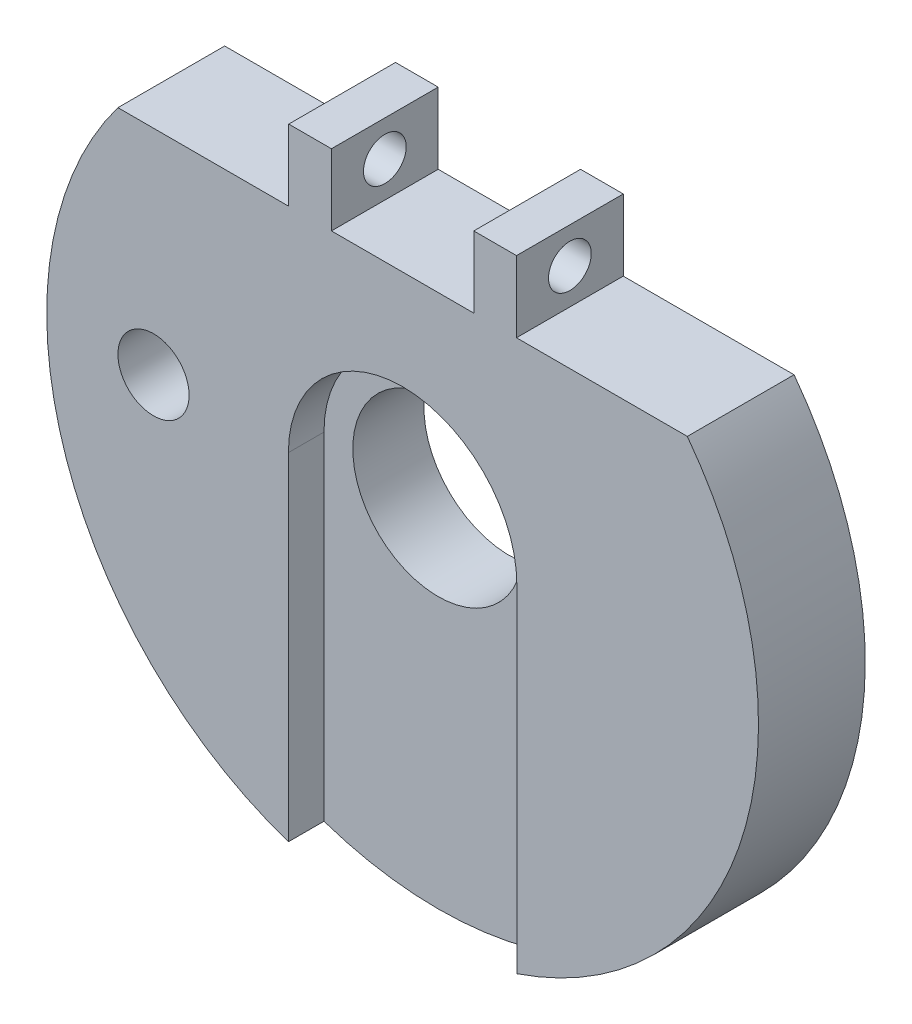
ISO-10303-21;
HEADER;
FILE_DESCRIPTION(('STEP AP214'),'2;1');
FILE_NAME('part.step','',(''),(''),'','','');
FILE_SCHEMA(('AUTOMOTIVE_DESIGN { 1 0 10303 214 1 1 1 1 }'));
ENDSEC;
DATA;
#1=APPLICATION_CONTEXT('core data for automotive mechanical design processes');
#2=APPLICATION_PROTOCOL_DEFINITION('international standard','automotive_design',2000,#1);
#3=PRODUCT_CONTEXT('',#1,'mechanical');
#4=PRODUCT('Part','Part','',(#3));
#5=PRODUCT_RELATED_PRODUCT_CATEGORY('part','',(#4));
#6=PRODUCT_DEFINITION_FORMATION('','',#4);
#7=PRODUCT_DEFINITION_CONTEXT('part definition',#1,'design');
#8=PRODUCT_DEFINITION('design','',#6,#7);
#9=PRODUCT_DEFINITION_SHAPE('','',#8);
#10=(LENGTH_UNIT() NAMED_UNIT(*) SI_UNIT(.MILLI.,.METRE.));
#11=(NAMED_UNIT(*) PLANE_ANGLE_UNIT() SI_UNIT($,.RADIAN.));
#12=(NAMED_UNIT(*) SI_UNIT($,.STERADIAN.) SOLID_ANGLE_UNIT());
#13=UNCERTAINTY_MEASURE_WITH_UNIT(LENGTH_MEASURE(1.E-05),#10,'distance_accuracy_value','');
#14=(GEOMETRIC_REPRESENTATION_CONTEXT(3) GLOBAL_UNCERTAINTY_ASSIGNED_CONTEXT((#13)) GLOBAL_UNIT_ASSIGNED_CONTEXT((#10,
#11,#12)) REPRESENTATION_CONTEXT('',''));
#15=CARTESIAN_POINT('',(0.,0.,0.));
#16=DIRECTION('',(0.,0.,1.));
#17=DIRECTION('',(1.,0.,0.));
#18=AXIS2_PLACEMENT_3D('',#15,#16,#17);
#19=CARTESIAN_POINT('',(-10.,40.,15.));
#20=DIRECTION('',(-1.,0.,0.));
#21=DIRECTION('',(0.,-1.,0.));
#22=AXIS2_PLACEMENT_3D('',#19,#20,#21);
#23=PLANE('',#22);
#24=CARTESIAN_POINT('',(-10.,35.,7.5));
#25=DIRECTION('',(-1.,0.,0.));
#26=DIRECTION('',(0.,-1.,0.));
#27=AXIS2_PLACEMENT_3D('',#24,#25,#26);
#28=CIRCLE('',#27,2.99999999999999);
#29=CARTESIAN_POINT('',(-10.,32.,7.5));
#30=VERTEX_POINT('',#29);
#31=EDGE_CURVE('E229',#30,#30,#28,.T.);
#32=ORIENTED_EDGE('',*,*,#31,.T.);
#33=EDGE_LOOP('',(#32));
#34=FACE_BOUND('',#33,.T.);
#35=DIRECTION('',(0.,1.,0.));
#36=VECTOR('',#35,1.);
#37=CARTESIAN_POINT('',(-10.,40.,0.));
#38=LINE('',#37,#36);
#39=CARTESIAN_POINT('',(-10.,30.,0.));
#40=VERTEX_POINT('',#39);
#41=CARTESIAN_POINT('',(-10.,40.,0.));
#42=VERTEX_POINT('',#41);
#43=EDGE_CURVE('E159',#40,#42,#38,.T.);
#44=ORIENTED_EDGE('',*,*,#43,.T.);
#45=DIRECTION('',(0.,0.,-1.));
#46=VECTOR('',#45,1.);
#47=CARTESIAN_POINT('',(-10.,40.,15.));
#48=LINE('',#47,#46);
#49=CARTESIAN_POINT('',(-10.,40.,15.));
#50=VERTEX_POINT('',#49);
#51=EDGE_CURVE('E198',#50,#42,#48,.T.);
#52=ORIENTED_EDGE('',*,*,#51,.F.);
#53=DIRECTION('',(0.,1.,0.));
#54=VECTOR('',#53,1.);
#55=CARTESIAN_POINT('',(-10.,40.,15.));
#56=LINE('',#55,#54);
#57=CARTESIAN_POINT('',(-10.,30.,15.));
#58=VERTEX_POINT('',#57);
#59=EDGE_CURVE('E179',#58,#50,#56,.T.);
#60=ORIENTED_EDGE('',*,*,#59,.F.);
#61=DIRECTION('',(0.,0.,-1.));
#62=VECTOR('',#61,1.);
#63=CARTESIAN_POINT('',(-10.,30.,15.));
#64=LINE('',#63,#62);
#65=EDGE_CURVE('E155',#58,#40,#64,.T.);
#66=ORIENTED_EDGE('',*,*,#65,.T.);
#67=EDGE_LOOP('',(#44,#52,#60,#66));
#68=FACE_BOUND('',#67,.T.);
#69=ADVANCED_FACE('F37',(#34,#68),#23,.F.);
#70=CARTESIAN_POINT('',(-16.,40.,15.));
#71=DIRECTION('',(0.,-1.,0.));
#72=DIRECTION('',(1.,0.,0.));
#73=AXIS2_PLACEMENT_3D('',#70,#71,#72);
#74=PLANE('',#73);
#75=DIRECTION('',(-1.,0.,0.));
#76=VECTOR('',#75,1.);
#77=CARTESIAN_POINT('',(-16.,40.,0.));
#78=LINE('',#77,#76);
#79=CARTESIAN_POINT('',(-16.,40.,0.));
#80=VERTEX_POINT('',#79);
#81=EDGE_CURVE('E162',#42,#80,#78,.T.);
#82=ORIENTED_EDGE('',*,*,#81,.T.);
#83=DIRECTION('',(0.,0.,-1.));
#84=VECTOR('',#83,1.);
#85=CARTESIAN_POINT('',(-16.,40.,15.));
#86=LINE('',#85,#84);
#87=CARTESIAN_POINT('',(-16.,40.,15.));
#88=VERTEX_POINT('',#87);
#89=EDGE_CURVE('E195',#88,#80,#86,.T.);
#90=ORIENTED_EDGE('',*,*,#89,.F.);
#91=DIRECTION('',(-1.,0.,0.));
#92=VECTOR('',#91,1.);
#93=CARTESIAN_POINT('',(-16.,40.,15.));
#94=LINE('',#93,#92);
#95=EDGE_CURVE('E109',#50,#88,#94,.T.);
#96=ORIENTED_EDGE('',*,*,#95,.F.);
#97=ORIENTED_EDGE('',*,*,#51,.T.);
#98=EDGE_LOOP('',(#82,#90,#96,#97));
#99=FACE_BOUND('',#98,.T.);
#100=ADVANCED_FACE('F267',(#99),#74,.F.);
#101=CARTESIAN_POINT('',(-16.,30.,15.));
#102=DIRECTION('',(1.,0.,0.));
#103=DIRECTION('',(0.,0.,-1.));
#104=AXIS2_PLACEMENT_3D('',#101,#102,#103);
#105=PLANE('',#104);
#106=CARTESIAN_POINT('',(-16.,35.,7.5));
#107=DIRECTION('',(-1.,0.,0.));
#108=DIRECTION('',(0.,0.,1.));
#109=AXIS2_PLACEMENT_3D('',#106,#107,#108);
#110=CIRCLE('',#109,3.);
#111=CARTESIAN_POINT('',(-16.,35.,10.5));
#112=VERTEX_POINT('',#111);
#113=EDGE_CURVE('E298',#112,#112,#110,.T.);
#114=ORIENTED_EDGE('',*,*,#113,.F.);
#115=EDGE_LOOP('',(#114));
#116=FACE_BOUND('',#115,.T.);
#117=DIRECTION('',(0.,-1.,0.));
#118=VECTOR('',#117,1.);
#119=CARTESIAN_POINT('',(-16.,30.,0.));
#120=LINE('',#119,#118);
#121=CARTESIAN_POINT('',(-16.,30.,0.));
#122=VERTEX_POINT('',#121);
#123=EDGE_CURVE('E165',#80,#122,#120,.T.);
#124=ORIENTED_EDGE('',*,*,#123,.T.);
#125=DIRECTION('',(0.,0.,-1.));
#126=VECTOR('',#125,1.);
#127=CARTESIAN_POINT('',(-16.,30.,15.));
#128=LINE('',#127,#126);
#129=CARTESIAN_POINT('',(-16.,30.,15.));
#130=VERTEX_POINT('',#129);
#131=EDGE_CURVE('E192',#130,#122,#128,.T.);
#132=ORIENTED_EDGE('',*,*,#131,.F.);
#133=DIRECTION('',(0.,-1.,0.));
#134=VECTOR('',#133,1.);
#135=CARTESIAN_POINT('',(-16.,30.,15.));
#136=LINE('',#135,#134);
#137=EDGE_CURVE('E241',#88,#130,#136,.T.);
#138=ORIENTED_EDGE('',*,*,#137,.F.);
#139=ORIENTED_EDGE('',*,*,#89,.T.);
#140=EDGE_LOOP('',(#124,#132,#138,#139));
#141=FACE_BOUND('',#140,.T.);
#142=ADVANCED_FACE('F270',(#116,#141),#105,.F.);
#143=CARTESIAN_POINT('',(-40.,30.,15.));
#144=DIRECTION('',(0.,-1.,0.));
#145=DIRECTION('',(0.,0.,-1.));
#146=AXIS2_PLACEMENT_3D('',#143,#144,#145);
#147=PLANE('',#146);
#148=DIRECTION('',(-1.,0.,0.));
#149=VECTOR('',#148,1.);
#150=CARTESIAN_POINT('',(-40.,30.,0.));
#151=LINE('',#150,#149);
#152=CARTESIAN_POINT('',(-40.,30.,0.));
#153=VERTEX_POINT('',#152);
#154=EDGE_CURVE('E167',#122,#153,#151,.T.);
#155=ORIENTED_EDGE('',*,*,#154,.T.);
#156=DIRECTION('',(0.,0.,-1.));
#157=VECTOR('',#156,1.);
#158=CARTESIAN_POINT('',(-40.,30.,15.));
#159=LINE('',#158,#157);
#160=CARTESIAN_POINT('',(-40.,30.,15.));
#161=VERTEX_POINT('',#160);
#162=EDGE_CURVE('E189',#161,#153,#159,.T.);
#163=ORIENTED_EDGE('',*,*,#162,.F.);
#164=DIRECTION('',(-1.,0.,0.));
#165=VECTOR('',#164,1.);
#166=CARTESIAN_POINT('',(-40.,30.,15.));
#167=LINE('',#166,#165);
#168=EDGE_CURVE('E243',#130,#161,#167,.T.);
#169=ORIENTED_EDGE('',*,*,#168,.F.);
#170=ORIENTED_EDGE('',*,*,#131,.T.);
#171=EDGE_LOOP('',(#155,#163,#169,#170));
#172=FACE_BOUND('',#171,.T.);
#173=ADVANCED_FACE('F275',(#172),#147,.F.);
#174=CARTESIAN_POINT('',(0.,0.,15.));
#175=DIRECTION('',(0.,0.,-1.));
#176=DIRECTION('',(-1.,0.,0.));
#177=AXIS2_PLACEMENT_3D('',#174,#175,#176);
#178=CYLINDRICAL_SURFACE('',#177,50.);
#179=CARTESIAN_POINT('',(0.,0.,15.));
#180=DIRECTION('',(0.,0.,1.));
#181=DIRECTION('',(1.,0.,0.));
#182=AXIS2_PLACEMENT_3D('',#179,#180,#181);
#183=CIRCLE('',#182,50.);
#184=CARTESIAN_POINT('',(16.05,-47.3539597077161,15.));
#185=VERTEX_POINT('',#184);
#186=CARTESIAN_POINT('',(40.,30.,15.));
#187=VERTEX_POINT('',#186);
#188=EDGE_CURVE('E245',#185,#187,#183,.T.);
#189=ORIENTED_EDGE('',*,*,#188,.F.);
#190=DIRECTION('',(0.,0.,-1.));
#191=VECTOR('',#190,1.);
#192=CARTESIAN_POINT('',(16.05,-47.3539597077161,15.));
#193=LINE('',#192,#191);
#194=CARTESIAN_POINT('',(16.05,-47.3539597077161,10.));
#195=VERTEX_POINT('',#194);
#196=EDGE_CURVE('E163',#185,#195,#193,.T.);
#197=ORIENTED_EDGE('',*,*,#196,.T.);
#198=CARTESIAN_POINT('',(0.,0.,10.));
#199=DIRECTION('',(0.,0.,1.));
#200=DIRECTION('',(1.,0.,0.));
#201=AXIS2_PLACEMENT_3D('',#198,#199,#200);
#202=CIRCLE('',#201,50.);
#203=CARTESIAN_POINT('',(-16.05,-47.3539597077161,10.));
#204=VERTEX_POINT('',#203);
#205=EDGE_CURVE('E11',#204,#195,#202,.T.);
#206=ORIENTED_EDGE('',*,*,#205,.F.);
#207=DIRECTION('',(0.,0.,-1.));
#208=VECTOR('',#207,1.);
#209=CARTESIAN_POINT('',(-16.05,-47.3539597077161,15.));
#210=LINE('',#209,#208);
#211=CARTESIAN_POINT('',(-16.05,-47.3539597077161,15.));
#212=VERTEX_POINT('',#211);
#213=EDGE_CURVE('E218',#204,#212,#210,.F.);
#214=ORIENTED_EDGE('',*,*,#213,.T.);
#215=EDGE_CURVE('E246',#161,#212,#183,.T.);
#216=ORIENTED_EDGE('',*,*,#215,.F.);
#217=ORIENTED_EDGE('',*,*,#162,.T.);
#218=CARTESIAN_POINT('',(0.,0.,0.));
#219=DIRECTION('',(0.,0.,1.));
#220=DIRECTION('',(1.,0.,0.));
#221=AXIS2_PLACEMENT_3D('',#218,#219,#220);
#222=CIRCLE('',#221,50.);
#223=CARTESIAN_POINT('',(40.,30.,0.));
#224=VERTEX_POINT('',#223);
#225=EDGE_CURVE('E169',#153,#224,#222,.T.);
#226=ORIENTED_EDGE('',*,*,#225,.T.);
#227=DIRECTION('',(0.,0.,-1.));
#228=VECTOR('',#227,1.);
#229=CARTESIAN_POINT('',(40.,30.,15.));
#230=LINE('',#229,#228);
#231=EDGE_CURVE('E186',#187,#224,#230,.T.);
#232=ORIENTED_EDGE('',*,*,#231,.F.);
#233=EDGE_LOOP('',(#189,#197,#206,#214,#216,#217,#226,#232));
#234=FACE_BOUND('',#233,.T.);
#235=ADVANCED_FACE('F281',(#234),#178,.T.);
#236=CARTESIAN_POINT('',(16.,30.,15.));
#237=DIRECTION('',(0.,-1.,0.));
#238=DIRECTION('',(0.,0.,-1.));
#239=AXIS2_PLACEMENT_3D('',#236,#237,#238);
#240=PLANE('',#239);
#241=DIRECTION('',(-1.,0.,0.));
#242=VECTOR('',#241,1.);
#243=CARTESIAN_POINT('',(16.,30.,0.));
#244=LINE('',#243,#242);
#245=CARTESIAN_POINT('',(16.,30.,0.));
#246=VERTEX_POINT('',#245);
#247=EDGE_CURVE('E171',#224,#246,#244,.T.);
#248=ORIENTED_EDGE('',*,*,#247,.T.);
#249=DIRECTION('',(0.,0.,-1.));
#250=VECTOR('',#249,1.);
#251=CARTESIAN_POINT('',(16.,30.,15.));
#252=LINE('',#251,#250);
#253=CARTESIAN_POINT('',(16.,30.,15.));
#254=VERTEX_POINT('',#253);
#255=EDGE_CURVE('E183',#254,#246,#252,.T.);
#256=ORIENTED_EDGE('',*,*,#255,.F.);
#257=DIRECTION('',(-1.,0.,0.));
#258=VECTOR('',#257,1.);
#259=CARTESIAN_POINT('',(16.,30.,15.));
#260=LINE('',#259,#258);
#261=EDGE_CURVE('E248',#187,#254,#260,.T.);
#262=ORIENTED_EDGE('',*,*,#261,.F.);
#263=ORIENTED_EDGE('',*,*,#231,.T.);
#264=EDGE_LOOP('',(#248,#256,#262,#263));
#265=FACE_BOUND('',#264,.T.);
#266=ADVANCED_FACE('F253',(#265),#240,.F.);
#267=CARTESIAN_POINT('',(16.,40.,15.));
#268=DIRECTION('',(-1.,0.,0.));
#269=DIRECTION('',(0.,0.,1.));
#270=AXIS2_PLACEMENT_3D('',#267,#268,#269);
#271=PLANE('',#270);
#272=CARTESIAN_POINT('',(16.,35.,7.5));
#273=DIRECTION('',(-1.,0.,0.));
#274=DIRECTION('',(0.,0.,1.));
#275=AXIS2_PLACEMENT_3D('',#272,#273,#274);
#276=CIRCLE('',#275,2.99999999999999);
#277=CARTESIAN_POINT('',(16.,35.,10.5));
#278=VERTEX_POINT('',#277);
#279=EDGE_CURVE('E40',#278,#278,#276,.T.);
#280=ORIENTED_EDGE('',*,*,#279,.T.);
#281=EDGE_LOOP('',(#280));
#282=FACE_BOUND('',#281,.T.);
#283=DIRECTION('',(0.,1.,0.));
#284=VECTOR('',#283,1.);
#285=CARTESIAN_POINT('',(16.,40.,0.));
#286=LINE('',#285,#284);
#287=CARTESIAN_POINT('',(16.,40.,0.));
#288=VERTEX_POINT('',#287);
#289=EDGE_CURVE('E173',#246,#288,#286,.T.);
#290=ORIENTED_EDGE('',*,*,#289,.T.);
#291=DIRECTION('',(0.,0.,-1.));
#292=VECTOR('',#291,1.);
#293=CARTESIAN_POINT('',(16.,40.,15.));
#294=LINE('',#293,#292);
#295=CARTESIAN_POINT('',(16.,40.,15.));
#296=VERTEX_POINT('',#295);
#297=EDGE_CURVE('E150',#296,#288,#294,.T.);
#298=ORIENTED_EDGE('',*,*,#297,.F.);
#299=DIRECTION('',(0.,1.,0.));
#300=VECTOR('',#299,1.);
#301=CARTESIAN_POINT('',(16.,40.,15.));
#302=LINE('',#301,#300);
#303=EDGE_CURVE('E138',#254,#296,#302,.T.);
#304=ORIENTED_EDGE('',*,*,#303,.F.);
#305=ORIENTED_EDGE('',*,*,#255,.T.);
#306=EDGE_LOOP('',(#290,#298,#304,#305));
#307=FACE_BOUND('',#306,.T.);
#308=ADVANCED_FACE('F257',(#282,#307),#271,.F.);
#309=CARTESIAN_POINT('',(10.,40.,15.));
#310=DIRECTION('',(0.,-1.,0.));
#311=DIRECTION('',(1.,0.,0.));
#312=AXIS2_PLACEMENT_3D('',#309,#310,#311);
#313=PLANE('',#312);
#314=DIRECTION('',(-1.,0.,0.));
#315=VECTOR('',#314,1.);
#316=CARTESIAN_POINT('',(10.,40.,0.));
#317=LINE('',#316,#315);
#318=CARTESIAN_POINT('',(10.,40.,0.));
#319=VERTEX_POINT('',#318);
#320=EDGE_CURVE('E147',#288,#319,#317,.T.);
#321=ORIENTED_EDGE('',*,*,#320,.T.);
#322=DIRECTION('',(0.,0.,-1.));
#323=VECTOR('',#322,1.);
#324=CARTESIAN_POINT('',(10.,40.,15.));
#325=LINE('',#324,#323);
#326=CARTESIAN_POINT('',(10.,40.,15.));
#327=VERTEX_POINT('',#326);
#328=EDGE_CURVE('E144',#327,#319,#325,.T.);
#329=ORIENTED_EDGE('',*,*,#328,.F.);
#330=DIRECTION('',(-1.,0.,0.));
#331=VECTOR('',#330,1.);
#332=CARTESIAN_POINT('',(10.,40.,15.));
#333=LINE('',#332,#331);
#334=EDGE_CURVE('E130',#296,#327,#333,.T.);
#335=ORIENTED_EDGE('',*,*,#334,.F.);
#336=ORIENTED_EDGE('',*,*,#297,.T.);
#337=EDGE_LOOP('',(#321,#329,#335,#336));
#338=FACE_BOUND('',#337,.T.);
#339=ADVANCED_FACE('F145',(#338),#313,.F.);
#340=CARTESIAN_POINT('',(10.,30.,15.));
#341=DIRECTION('',(1.,0.,0.));
#342=DIRECTION('',(0.,1.,0.));
#343=AXIS2_PLACEMENT_3D('',#340,#341,#342);
#344=PLANE('',#343);
#345=CARTESIAN_POINT('',(10.,35.,7.5));
#346=DIRECTION('',(1.,0.,0.));
#347=DIRECTION('',(0.,1.,0.));
#348=AXIS2_PLACEMENT_3D('',#345,#346,#347);
#349=CIRCLE('',#348,2.99999999999999);
#350=CARTESIAN_POINT('',(10.,38.,7.5));
#351=VERTEX_POINT('',#350);
#352=EDGE_CURVE('E225',#351,#351,#349,.T.);
#353=ORIENTED_EDGE('',*,*,#352,.T.);
#354=EDGE_LOOP('',(#353));
#355=FACE_BOUND('',#354,.T.);
#356=DIRECTION('',(0.,-1.,0.));
#357=VECTOR('',#356,1.);
#358=CARTESIAN_POINT('',(10.,30.,0.));
#359=LINE('',#358,#357);
#360=CARTESIAN_POINT('',(10.,30.,0.));
#361=VERTEX_POINT('',#360);
#362=EDGE_CURVE('E176',#319,#361,#359,.T.);
#363=ORIENTED_EDGE('',*,*,#362,.T.);
#364=DIRECTION('',(0.,0.,-1.));
#365=VECTOR('',#364,1.);
#366=CARTESIAN_POINT('',(10.,30.,15.));
#367=LINE('',#366,#365);
#368=CARTESIAN_POINT('',(10.,30.,15.));
#369=VERTEX_POINT('',#368);
#370=EDGE_CURVE('E151',#369,#361,#367,.T.);
#371=ORIENTED_EDGE('',*,*,#370,.F.);
#372=DIRECTION('',(0.,-1.,0.));
#373=VECTOR('',#372,1.);
#374=CARTESIAN_POINT('',(10.,30.,15.));
#375=LINE('',#374,#373);
#376=EDGE_CURVE('E135',#327,#369,#375,.T.);
#377=ORIENTED_EDGE('',*,*,#376,.F.);
#378=ORIENTED_EDGE('',*,*,#328,.T.);
#379=EDGE_LOOP('',(#363,#371,#377,#378));
#380=FACE_BOUND('',#379,.T.);
#381=ADVANCED_FACE('F153',(#355,#380),#344,.F.);
#382=CARTESIAN_POINT('',(-10.,30.,15.));
#383=DIRECTION('',(0.,-1.,0.));
#384=DIRECTION('',(0.,0.,-1.));
#385=AXIS2_PLACEMENT_3D('',#382,#383,#384);
#386=PLANE('',#385);
#387=DIRECTION('',(-1.,0.,0.));
#388=VECTOR('',#387,1.);
#389=CARTESIAN_POINT('',(-10.,30.,0.));
#390=LINE('',#389,#388);
#391=EDGE_CURVE('E100',#361,#40,#390,.T.);
#392=ORIENTED_EDGE('',*,*,#391,.T.);
#393=ORIENTED_EDGE('',*,*,#65,.F.);
#394=DIRECTION('',(-1.,0.,0.));
#395=VECTOR('',#394,1.);
#396=CARTESIAN_POINT('',(-10.,30.,15.));
#397=LINE('',#396,#395);
#398=EDGE_CURVE('E61',#369,#58,#397,.T.);
#399=ORIENTED_EDGE('',*,*,#398,.F.);
#400=ORIENTED_EDGE('',*,*,#370,.T.);
#401=EDGE_LOOP('',(#392,#393,#399,#400));
#402=FACE_BOUND('',#401,.T.);
#403=ADVANCED_FACE('F261',(#402),#386,.F.);
#404=CARTESIAN_POINT('',(0.,0.,15.));
#405=DIRECTION('',(0.,0.,1.));
#406=DIRECTION('',(1.,0.,0.));
#407=AXIS2_PLACEMENT_3D('',#404,#405,#406);
#408=PLANE('',#407);
#409=CARTESIAN_POINT('',(-35.,0.,15.));
#410=DIRECTION('',(0.,0.,1.));
#411=DIRECTION('',(1.,0.,0.));
#412=AXIS2_PLACEMENT_3D('',#409,#410,#411);
#413=CIRCLE('',#412,5.);
#414=CARTESIAN_POINT('',(-30.,0.,15.));
#415=VERTEX_POINT('',#414);
#416=EDGE_CURVE('E310',#415,#415,#413,.T.);
#417=ORIENTED_EDGE('',*,*,#416,.F.);
#418=EDGE_LOOP('',(#417));
#419=FACE_BOUND('',#418,.T.);
#420=DIRECTION('',(0.,1.,0.));
#421=VECTOR('',#420,1.);
#422=CARTESIAN_POINT('',(16.05,0.,15.));
#423=LINE('',#422,#421);
#424=CARTESIAN_POINT('',(16.05,0.,15.));
#425=VERTEX_POINT('',#424);
#426=EDGE_CURVE('E45',#185,#425,#423,.T.);
#427=ORIENTED_EDGE('',*,*,#426,.F.);
#428=ORIENTED_EDGE('',*,*,#188,.T.);
#429=ORIENTED_EDGE('',*,*,#261,.T.);
#430=ORIENTED_EDGE('',*,*,#303,.T.);
#431=ORIENTED_EDGE('',*,*,#334,.T.);
#432=ORIENTED_EDGE('',*,*,#376,.T.);
#433=ORIENTED_EDGE('',*,*,#398,.T.);
#434=ORIENTED_EDGE('',*,*,#59,.T.);
#435=ORIENTED_EDGE('',*,*,#95,.T.);
#436=ORIENTED_EDGE('',*,*,#137,.T.);
#437=ORIENTED_EDGE('',*,*,#168,.T.);
#438=ORIENTED_EDGE('',*,*,#215,.T.);
#439=DIRECTION('',(0.,-1.,0.));
#440=VECTOR('',#439,1.);
#441=CARTESIAN_POINT('',(-16.05,0.,15.));
#442=LINE('',#441,#440);
#443=CARTESIAN_POINT('',(-16.05,0.,15.));
#444=VERTEX_POINT('',#443);
#445=EDGE_CURVE('E224',#444,#212,#442,.T.);
#446=ORIENTED_EDGE('',*,*,#445,.F.);
#447=CARTESIAN_POINT('',(0.,0.,15.));
#448=DIRECTION('',(0.,0.,1.));
#449=DIRECTION('',(1.,0.,0.));
#450=AXIS2_PLACEMENT_3D('',#447,#448,#449);
#451=CIRCLE('',#450,16.05);
#452=EDGE_CURVE('E52',#425,#444,#451,.T.);
#453=ORIENTED_EDGE('',*,*,#452,.F.);
#454=EDGE_LOOP('',(#427,#428,#429,#430,#431,#432,#433,#434,#435,#436,#437,#438,#446,#453));
#455=FACE_BOUND('',#454,.T.);
#456=ADVANCED_FACE('F133',(#419,#455),#408,.T.);
#457=CARTESIAN_POINT('',(0.,0.,0.));
#458=DIRECTION('',(0.,0.,1.));
#459=DIRECTION('',(1.,0.,0.));
#460=AXIS2_PLACEMENT_3D('',#457,#458,#459);
#461=PLANE('',#460);
#462=CARTESIAN_POINT('',(0.,0.,0.));
#463=DIRECTION('',(0.,0.,1.));
#464=DIRECTION('',(1.,0.,0.));
#465=AXIS2_PLACEMENT_3D('',#462,#463,#464);
#466=CIRCLE('',#465,12.);
#467=CARTESIAN_POINT('',(12.,0.,0.));
#468=VERTEX_POINT('',#467);
#469=EDGE_CURVE('E313',#468,#468,#466,.T.);
#470=ORIENTED_EDGE('',*,*,#469,.T.);
#471=EDGE_LOOP('',(#470));
#472=FACE_BOUND('',#471,.T.);
#473=CARTESIAN_POINT('',(-35.,0.,0.));
#474=DIRECTION('',(0.,0.,1.));
#475=DIRECTION('',(1.,0.,0.));
#476=AXIS2_PLACEMENT_3D('',#473,#474,#475);
#477=CIRCLE('',#476,3.5);
#478=CARTESIAN_POINT('',(-31.5,0.,0.));
#479=VERTEX_POINT('',#478);
#480=EDGE_CURVE('E301',#479,#479,#477,.T.);
#481=ORIENTED_EDGE('',*,*,#480,.T.);
#482=EDGE_LOOP('',(#481));
#483=FACE_BOUND('',#482,.T.);
#484=ORIENTED_EDGE('',*,*,#43,.F.);
#485=ORIENTED_EDGE('',*,*,#391,.F.);
#486=ORIENTED_EDGE('',*,*,#362,.F.);
#487=ORIENTED_EDGE('',*,*,#320,.F.);
#488=ORIENTED_EDGE('',*,*,#289,.F.);
#489=ORIENTED_EDGE('',*,*,#247,.F.);
#490=ORIENTED_EDGE('',*,*,#225,.F.);
#491=ORIENTED_EDGE('',*,*,#154,.F.);
#492=ORIENTED_EDGE('',*,*,#123,.F.);
#493=ORIENTED_EDGE('',*,*,#81,.F.);
#494=EDGE_LOOP('',(#484,#485,#486,#487,#488,#489,#490,#491,#492,#493));
#495=FACE_BOUND('',#494,.T.);
#496=ADVANCED_FACE('F260',(#472,#483,#495),#461,.F.);
#497=CARTESIAN_POINT('',(0.,0.,10.));
#498=DIRECTION('',(0.,0.,1.));
#499=DIRECTION('',(1.,0.,0.));
#500=AXIS2_PLACEMENT_3D('',#497,#498,#499);
#501=PLANE('',#500);
#502=CARTESIAN_POINT('',(0.,0.,10.));
#503=DIRECTION('',(0.,0.,1.));
#504=DIRECTION('',(1.,0.,0.));
#505=AXIS2_PLACEMENT_3D('',#502,#503,#504);
#506=CIRCLE('',#505,12.);
#507=CARTESIAN_POINT('',(12.,0.,10.));
#508=VERTEX_POINT('',#507);
#509=EDGE_CURVE('E316',#508,#508,#506,.T.);
#510=ORIENTED_EDGE('',*,*,#509,.F.);
#511=EDGE_LOOP('',(#510));
#512=FACE_BOUND('',#511,.T.);
#513=DIRECTION('',(0.,-1.,0.));
#514=VECTOR('',#513,1.);
#515=CARTESIAN_POINT('',(-16.05,0.,10.));
#516=LINE('',#515,#514);
#517=CARTESIAN_POINT('',(-16.05,0.,10.));
#518=VERTEX_POINT('',#517);
#519=EDGE_CURVE('E289',#518,#204,#516,.T.);
#520=ORIENTED_EDGE('',*,*,#519,.T.);
#521=ORIENTED_EDGE('',*,*,#205,.T.);
#522=DIRECTION('',(0.,1.,0.));
#523=VECTOR('',#522,1.);
#524=CARTESIAN_POINT('',(16.05,0.,10.));
#525=LINE('',#524,#523);
#526=CARTESIAN_POINT('',(16.05,0.,10.));
#527=VERTEX_POINT('',#526);
#528=EDGE_CURVE('E232',#195,#527,#525,.T.);
#529=ORIENTED_EDGE('',*,*,#528,.T.);
#530=CARTESIAN_POINT('',(0.,0.,10.));
#531=DIRECTION('',(0.,0.,1.));
#532=DIRECTION('',(1.,0.,0.));
#533=AXIS2_PLACEMENT_3D('',#530,#531,#532);
#534=CIRCLE('',#533,16.05);
#535=EDGE_CURVE('E217',#527,#518,#534,.T.);
#536=ORIENTED_EDGE('',*,*,#535,.T.);
#537=EDGE_LOOP('',(#520,#521,#529,#536));
#538=FACE_BOUND('',#537,.T.);
#539=ADVANCED_FACE('F292',(#512,#538),#501,.T.);
#540=CARTESIAN_POINT('',(16.05,0.,10.));
#541=DIRECTION('',(1.,0.,0.));
#542=DIRECTION('',(0.,1.,0.));
#543=AXIS2_PLACEMENT_3D('',#540,#541,#542);
#544=PLANE('',#543);
#545=ORIENTED_EDGE('',*,*,#426,.T.);
#546=DIRECTION('',(0.,0.,1.));
#547=VECTOR('',#546,1.);
#548=CARTESIAN_POINT('',(16.05,0.,10.));
#549=LINE('',#548,#547);
#550=EDGE_CURVE('E208',#527,#425,#549,.T.);
#551=ORIENTED_EDGE('',*,*,#550,.F.);
#552=ORIENTED_EDGE('',*,*,#528,.F.);
#553=ORIENTED_EDGE('',*,*,#196,.F.);
#554=EDGE_LOOP('',(#545,#551,#552,#553));
#555=FACE_BOUND('',#554,.T.);
#556=ADVANCED_FACE('F205',(#555),#544,.F.);
#557=CARTESIAN_POINT('',(-16.05,0.,10.));
#558=DIRECTION('',(-1.,0.,0.));
#559=DIRECTION('',(0.,-1.,0.));
#560=AXIS2_PLACEMENT_3D('',#557,#558,#559);
#561=PLANE('',#560);
#562=ORIENTED_EDGE('',*,*,#519,.F.);
#563=DIRECTION('',(0.,0.,1.));
#564=VECTOR('',#563,1.);
#565=CARTESIAN_POINT('',(-16.05,0.,10.));
#566=LINE('',#565,#564);
#567=EDGE_CURVE('E219',#518,#444,#566,.T.);
#568=ORIENTED_EDGE('',*,*,#567,.T.);
#569=ORIENTED_EDGE('',*,*,#445,.T.);
#570=ORIENTED_EDGE('',*,*,#213,.F.);
#571=EDGE_LOOP('',(#562,#568,#569,#570));
#572=FACE_BOUND('',#571,.T.);
#573=ADVANCED_FACE('F288',(#572),#561,.F.);
#574=CARTESIAN_POINT('',(0.,0.,10.));
#575=DIRECTION('',(0.,0.,1.));
#576=DIRECTION('',(1.,0.,0.));
#577=AXIS2_PLACEMENT_3D('',#574,#575,#576);
#578=CYLINDRICAL_SURFACE('',#577,16.05);
#579=ORIENTED_EDGE('',*,*,#452,.T.);
#580=ORIENTED_EDGE('',*,*,#567,.F.);
#581=ORIENTED_EDGE('',*,*,#535,.F.);
#582=ORIENTED_EDGE('',*,*,#550,.T.);
#583=EDGE_LOOP('',(#579,#580,#581,#582));
#584=FACE_BOUND('',#583,.T.);
#585=ADVANCED_FACE('F215',(#584),#578,.F.);
#586=CARTESIAN_POINT('',(-16.,35.,7.5));
#587=DIRECTION('',(-1.,0.,0.));
#588=DIRECTION('',(0.,0.,1.));
#589=AXIS2_PLACEMENT_3D('',#586,#587,#588);
#590=CYLINDRICAL_SURFACE('',#589,2.99999999999999);
#591=ORIENTED_EDGE('',*,*,#279,.F.);
#592=EDGE_LOOP('',(#591));
#593=FACE_BOUND('',#592,.T.);
#594=ORIENTED_EDGE('',*,*,#352,.F.);
#595=EDGE_LOOP('',(#594));
#596=FACE_BOUND('',#595,.T.);
#597=ADVANCED_FACE('F345',(#593,#596),#590,.F.);
#598=ORIENTED_EDGE('',*,*,#113,.T.);
#599=EDGE_LOOP('',(#598));
#600=FACE_BOUND('',#599,.T.);
#601=ORIENTED_EDGE('',*,*,#31,.F.);
#602=EDGE_LOOP('',(#601));
#603=FACE_BOUND('',#602,.T.);
#604=ADVANCED_FACE('F342',(#600,#603),#590,.F.);
#605=CARTESIAN_POINT('',(-35.,0.,15.));
#606=DIRECTION('',(0.,0.,1.));
#607=DIRECTION('',(1.,0.,0.));
#608=AXIS2_PLACEMENT_3D('',#605,#606,#607);
#609=CYLINDRICAL_SURFACE('',#608,3.5);
#610=ORIENTED_EDGE('',*,*,#480,.F.);
#611=EDGE_LOOP('',(#610));
#612=FACE_BOUND('',#611,.T.);
#613=CARTESIAN_POINT('',(-35.,0.,5.));
#614=DIRECTION('',(0.,0.,1.));
#615=DIRECTION('',(1.,0.,0.));
#616=AXIS2_PLACEMENT_3D('',#613,#614,#615);
#617=CIRCLE('',#616,3.5);
#618=CARTESIAN_POINT('',(-31.5,0.,5.));
#619=VERTEX_POINT('',#618);
#620=EDGE_CURVE('E304',#619,#619,#617,.T.);
#621=ORIENTED_EDGE('',*,*,#620,.T.);
#622=EDGE_LOOP('',(#621));
#623=FACE_BOUND('',#622,.T.);
#624=ADVANCED_FACE('F344',(#612,#623),#609,.F.);
#625=CARTESIAN_POINT('',(-31.5,0.,5.));
#626=DIRECTION('',(0.,0.,-1.));
#627=DIRECTION('',(-1.,0.,0.));
#628=AXIS2_PLACEMENT_3D('',#625,#626,#627);
#629=PLANE('',#628);
#630=ORIENTED_EDGE('',*,*,#620,.F.);
#631=EDGE_LOOP('',(#630));
#632=FACE_BOUND('',#631,.T.);
#633=CARTESIAN_POINT('',(-35.,0.,5.));
#634=DIRECTION('',(0.,0.,1.));
#635=DIRECTION('',(1.,0.,0.));
#636=AXIS2_PLACEMENT_3D('',#633,#634,#635);
#637=CIRCLE('',#636,5.);
#638=CARTESIAN_POINT('',(-30.,0.,5.));
#639=VERTEX_POINT('',#638);
#640=EDGE_CURVE('E307',#639,#639,#637,.T.);
#641=ORIENTED_EDGE('',*,*,#640,.T.);
#642=EDGE_LOOP('',(#641));
#643=FACE_BOUND('',#642,.T.);
#644=ADVANCED_FACE('F351',(#632,#643),#629,.F.);
#645=CARTESIAN_POINT('',(-35.,0.,15.));
#646=DIRECTION('',(0.,0.,1.));
#647=DIRECTION('',(1.,0.,0.));
#648=AXIS2_PLACEMENT_3D('',#645,#646,#647);
#649=CYLINDRICAL_SURFACE('',#648,5.);
#650=ORIENTED_EDGE('',*,*,#640,.F.);
#651=EDGE_LOOP('',(#650));
#652=FACE_BOUND('',#651,.T.);
#653=ORIENTED_EDGE('',*,*,#416,.T.);
#654=EDGE_LOOP('',(#653));
#655=FACE_BOUND('',#654,.T.);
#656=ADVANCED_FACE('F358',(#652,#655),#649,.F.);
#657=CARTESIAN_POINT('',(0.,0.,10.));
#658=DIRECTION('',(0.,0.,1.));
#659=DIRECTION('',(1.,0.,0.));
#660=AXIS2_PLACEMENT_3D('',#657,#658,#659);
#661=CYLINDRICAL_SURFACE('',#660,12.);
#662=ORIENTED_EDGE('',*,*,#469,.F.);
#663=EDGE_LOOP('',(#662));
#664=FACE_BOUND('',#663,.T.);
#665=ORIENTED_EDGE('',*,*,#509,.T.);
#666=EDGE_LOOP('',(#665));
#667=FACE_BOUND('',#666,.T.);
#668=ADVANCED_FACE('F320',(#664,#667),#661,.F.);
#669=CLOSED_SHELL('',(#69,#100,#142,#173,#235,#266,#308,#339,#381,#403,#456,#496,#539,#556,#573,
#585,#597,#604,#624,#644,#656,#668));
#670=MANIFOLD_SOLID_BREP('B2',#669);
#671=ADVANCED_BREP_SHAPE_REPRESENTATION('',(#18,#670),#14);
#672=SHAPE_DEFINITION_REPRESENTATION(#9,#671);
ENDSEC;
END-ISO-10303-21;
